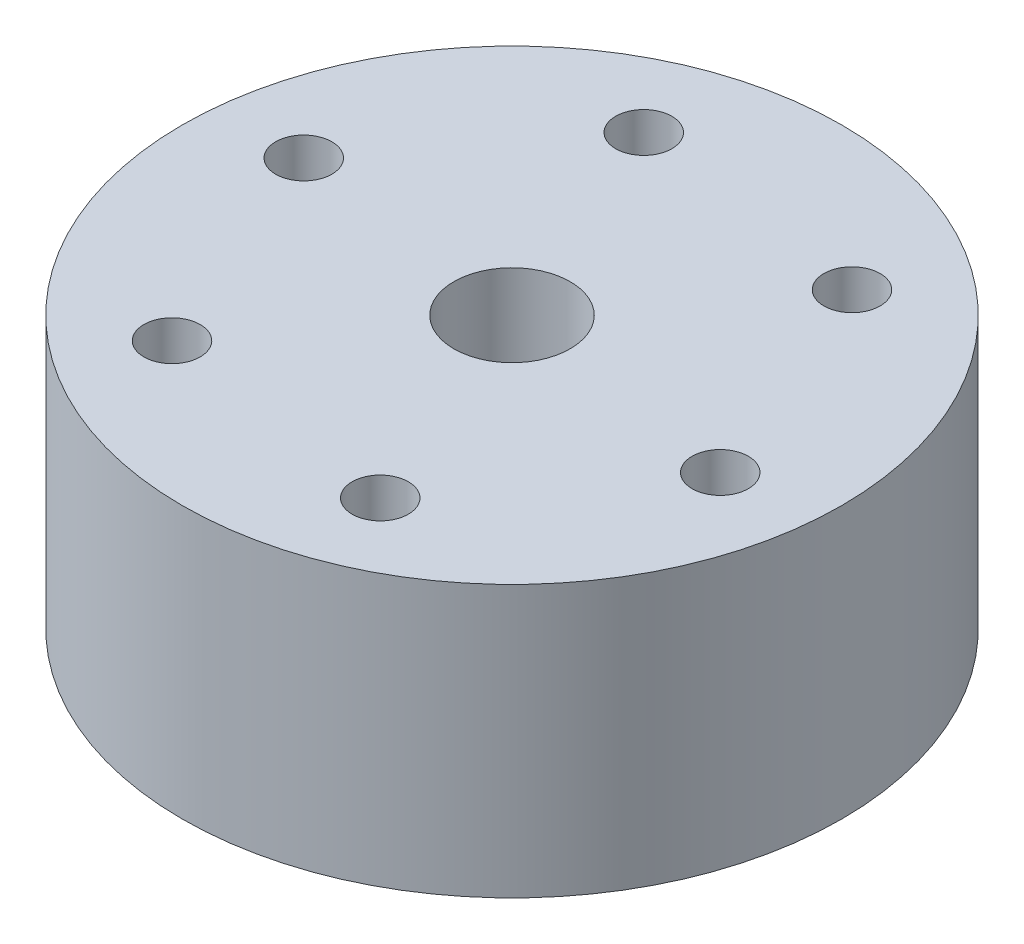
ISO-10303-21;
HEADER;
FILE_DESCRIPTION(('STEP AP214'),'2;1');
FILE_NAME('part.step','',(''),(''),'','','');
FILE_SCHEMA(('AUTOMOTIVE_DESIGN { 1 0 10303 214 1 1 1 1 }'));
ENDSEC;
DATA;
#1=APPLICATION_CONTEXT('core data for automotive mechanical design processes');
#2=APPLICATION_PROTOCOL_DEFINITION('international standard','automotive_design',2000,#1);
#3=PRODUCT_CONTEXT('',#1,'mechanical');
#4=PRODUCT('Part','Part','',(#3));
#5=PRODUCT_RELATED_PRODUCT_CATEGORY('part','',(#4));
#6=PRODUCT_DEFINITION_FORMATION('','',#4);
#7=PRODUCT_DEFINITION_CONTEXT('part definition',#1,'design');
#8=PRODUCT_DEFINITION('design','',#6,#7);
#9=PRODUCT_DEFINITION_SHAPE('','',#8);
#10=(LENGTH_UNIT() NAMED_UNIT(*) SI_UNIT(.MILLI.,.METRE.));
#11=(NAMED_UNIT(*) PLANE_ANGLE_UNIT() SI_UNIT($,.RADIAN.));
#12=(NAMED_UNIT(*) SI_UNIT($,.STERADIAN.) SOLID_ANGLE_UNIT());
#13=UNCERTAINTY_MEASURE_WITH_UNIT(LENGTH_MEASURE(1.E-05),#10,'distance_accuracy_value','');
#14=(GEOMETRIC_REPRESENTATION_CONTEXT(3) GLOBAL_UNCERTAINTY_ASSIGNED_CONTEXT((#13)) GLOBAL_UNIT_ASSIGNED_CONTEXT((#10,
#11,#12)) REPRESENTATION_CONTEXT('',''));
#15=CARTESIAN_POINT('',(0.,0.,0.));
#16=DIRECTION('',(0.,0.,1.));
#17=DIRECTION('',(1.,0.,0.));
#18=AXIS2_PLACEMENT_3D('',#15,#16,#17);
#19=CARTESIAN_POINT('',(0.,34.5,490.));
#20=DIRECTION('',(0.,-1.,0.));
#21=DIRECTION('',(0.,0.,-1.));
#22=AXIS2_PLACEMENT_3D('',#19,#20,#21);
#23=CYLINDRICAL_SURFACE('',#22,17.);
#24=CARTESIAN_POINT('',(0.,34.5,490.));
#25=DIRECTION('',(0.,1.,0.));
#26=DIRECTION('',(0.,0.,1.));
#27=AXIS2_PLACEMENT_3D('',#24,#25,#26);
#28=CIRCLE('',#27,17.);
#29=CARTESIAN_POINT('',(0.,34.5,507.));
#30=VERTEX_POINT('',#29);
#31=EDGE_CURVE('E10',#30,#30,#28,.T.);
#32=ORIENTED_EDGE('',*,*,#31,.F.);
#33=EDGE_LOOP('',(#32));
#34=FACE_BOUND('',#33,.T.);
#35=CARTESIAN_POINT('',(0.,20.5,490.));
#36=DIRECTION('',(0.,1.,0.));
#37=DIRECTION('',(0.,0.,1.));
#38=AXIS2_PLACEMENT_3D('',#35,#36,#37);
#39=CIRCLE('',#38,17.);
#40=CARTESIAN_POINT('',(0.,20.5,507.));
#41=VERTEX_POINT('',#40);
#42=EDGE_CURVE('E42',#41,#41,#39,.T.);
#43=ORIENTED_EDGE('',*,*,#42,.T.);
#44=EDGE_LOOP('',(#43));
#45=FACE_BOUND('',#44,.T.);
#46=ADVANCED_FACE('F41',(#34,#45),#23,.T.);
#47=CARTESIAN_POINT('',(0.,34.5,490.));
#48=DIRECTION('',(0.,1.,0.));
#49=DIRECTION('',(0.,0.,1.));
#50=AXIS2_PLACEMENT_3D('',#47,#48,#49);
#51=PLANE('',#50);
#52=CARTESIAN_POINT('',(0.,34.5,490.));
#53=DIRECTION('',(0.,1.,0.));
#54=DIRECTION('',(0.,0.,1.));
#55=AXIS2_PLACEMENT_3D('',#52,#53,#54);
#56=CIRCLE('',#55,3.);
#57=CARTESIAN_POINT('',(0.,34.5,493.));
#58=VERTEX_POINT('',#57);
#59=EDGE_CURVE('E91',#58,#58,#56,.T.);
#60=ORIENTED_EDGE('',*,*,#59,.F.);
#61=EDGE_LOOP('',(#60));
#62=FACE_BOUND('',#61,.T.);
#63=CARTESIAN_POINT('',(12.3901942531443,34.5,491.653204878214));
#64=DIRECTION('',(0.,1.,0.));
#65=DIRECTION('',(0.,0.,1.));
#66=AXIS2_PLACEMENT_3D('',#63,#64,#65);
#67=CIRCLE('',#66,1.45);
#68=CARTESIAN_POINT('',(12.3901942531443,34.5,493.103204878214));
#69=VERTEX_POINT('',#68);
#70=EDGE_CURVE('E54',#69,#69,#67,.T.);
#71=ORIENTED_EDGE('',*,*,#70,.F.);
#72=EDGE_LOOP('',(#71));
#73=FACE_BOUND('',#72,.T.);
#74=CARTESIAN_POINT('',(7.62681454876585,34.5,480.09637945806));
#75=DIRECTION('',(0.,1.,0.));
#76=DIRECTION('',(0.,0.,1.));
#77=AXIS2_PLACEMENT_3D('',#74,#75,#76);
#78=CIRCLE('',#77,1.45);
#79=CARTESIAN_POINT('',(7.62681454876585,34.5,481.54637945806));
#80=VERTEX_POINT('',#79);
#81=EDGE_CURVE('E89',#80,#80,#78,.T.);
#82=ORIENTED_EDGE('',*,*,#81,.F.);
#83=EDGE_LOOP('',(#82));
#84=FACE_BOUND('',#83,.T.);
#85=CARTESIAN_POINT('',(-4.76337970437842,34.5,478.443174579846));
#86=DIRECTION('',(0.,1.,0.));
#87=DIRECTION('',(0.,0.,1.));
#88=AXIS2_PLACEMENT_3D('',#85,#86,#87);
#89=CIRCLE('',#88,1.45);
#90=CARTESIAN_POINT('',(-4.76337970437842,34.5,479.893174579846));
#91=VERTEX_POINT('',#90);
#92=EDGE_CURVE('E60',#91,#91,#89,.T.);
#93=ORIENTED_EDGE('',*,*,#92,.F.);
#94=EDGE_LOOP('',(#93));
#95=FACE_BOUND('',#94,.T.);
#96=CARTESIAN_POINT('',(-12.3901942531443,34.5,488.346795121786));
#97=DIRECTION('',(0.,1.,0.));
#98=DIRECTION('',(0.,0.,1.));
#99=AXIS2_PLACEMENT_3D('',#96,#97,#98);
#100=CIRCLE('',#99,1.45);
#101=CARTESIAN_POINT('',(-12.3901942531443,34.5,489.796795121786));
#102=VERTEX_POINT('',#101);
#103=EDGE_CURVE('E67',#102,#102,#100,.T.);
#104=ORIENTED_EDGE('',*,*,#103,.F.);
#105=EDGE_LOOP('',(#104));
#106=FACE_BOUND('',#105,.T.);
#107=CARTESIAN_POINT('',(-7.62681454876585,34.5,499.90362054194));
#108=DIRECTION('',(0.,1.,0.));
#109=DIRECTION('',(0.,0.,1.));
#110=AXIS2_PLACEMENT_3D('',#107,#108,#109);
#111=CIRCLE('',#110,1.45);
#112=CARTESIAN_POINT('',(-7.62681454876585,34.5,501.35362054194));
#113=VERTEX_POINT('',#112);
#114=EDGE_CURVE('E74',#113,#113,#111,.T.);
#115=ORIENTED_EDGE('',*,*,#114,.F.);
#116=EDGE_LOOP('',(#115));
#117=FACE_BOUND('',#116,.T.);
#118=CARTESIAN_POINT('',(4.76337970437843,34.5,501.556825420154));
#119=DIRECTION('',(0.,1.,0.));
#120=DIRECTION('',(0.,0.,1.));
#121=AXIS2_PLACEMENT_3D('',#118,#119,#120);
#122=CIRCLE('',#121,1.45);
#123=CARTESIAN_POINT('',(4.76337970437843,34.5,503.006825420154));
#124=VERTEX_POINT('',#123);
#125=EDGE_CURVE('E85',#124,#124,#122,.T.);
#126=ORIENTED_EDGE('',*,*,#125,.F.);
#127=EDGE_LOOP('',(#126));
#128=FACE_BOUND('',#127,.T.);
#129=ORIENTED_EDGE('',*,*,#31,.T.);
#130=EDGE_LOOP('',(#129));
#131=FACE_BOUND('',#130,.T.);
#132=ADVANCED_FACE('F111',(#62,#73,#84,#95,#106,#117,#128,#131),#51,.T.);
#133=CARTESIAN_POINT('',(0.,20.5,490.));
#134=DIRECTION('',(0.,1.,0.));
#135=DIRECTION('',(0.,0.,1.));
#136=AXIS2_PLACEMENT_3D('',#133,#134,#135);
#137=PLANE('',#136);
#138=CARTESIAN_POINT('',(0.,20.5,490.));
#139=DIRECTION('',(0.,1.,0.));
#140=DIRECTION('',(0.,0.,1.));
#141=AXIS2_PLACEMENT_3D('',#138,#139,#140);
#142=CIRCLE('',#141,3.);
#143=CARTESIAN_POINT('',(0.,20.5,493.));
#144=VERTEX_POINT('',#143);
#145=EDGE_CURVE('E103',#144,#144,#142,.T.);
#146=ORIENTED_EDGE('',*,*,#145,.T.);
#147=EDGE_LOOP('',(#146));
#148=FACE_BOUND('',#147,.T.);
#149=CARTESIAN_POINT('',(12.3901942531443,20.5,491.653204878214));
#150=DIRECTION('',(0.,1.,0.));
#151=DIRECTION('',(0.,0.,1.));
#152=AXIS2_PLACEMENT_3D('',#149,#150,#151);
#153=CIRCLE('',#152,1.45);
#154=CARTESIAN_POINT('',(12.3901942531443,20.5,493.103204878214));
#155=VERTEX_POINT('',#154);
#156=EDGE_CURVE('E90',#155,#155,#153,.T.);
#157=ORIENTED_EDGE('',*,*,#156,.T.);
#158=EDGE_LOOP('',(#157));
#159=FACE_BOUND('',#158,.T.);
#160=CARTESIAN_POINT('',(7.62681454876585,20.5,480.09637945806));
#161=DIRECTION('',(0.,1.,0.));
#162=DIRECTION('',(0.,0.,1.));
#163=AXIS2_PLACEMENT_3D('',#160,#161,#162);
#164=CIRCLE('',#163,1.45);
#165=CARTESIAN_POINT('',(7.62681454876585,20.5,481.54637945806));
#166=VERTEX_POINT('',#165);
#167=EDGE_CURVE('E61',#166,#166,#164,.T.);
#168=ORIENTED_EDGE('',*,*,#167,.T.);
#169=EDGE_LOOP('',(#168));
#170=FACE_BOUND('',#169,.T.);
#171=CARTESIAN_POINT('',(-4.76337970437842,20.5,478.443174579846));
#172=DIRECTION('',(0.,1.,0.));
#173=DIRECTION('',(0.,0.,1.));
#174=AXIS2_PLACEMENT_3D('',#171,#172,#173);
#175=CIRCLE('',#174,1.45);
#176=CARTESIAN_POINT('',(-4.76337970437842,20.5,479.893174579846));
#177=VERTEX_POINT('',#176);
#178=EDGE_CURVE('E64',#177,#177,#175,.T.);
#179=ORIENTED_EDGE('',*,*,#178,.T.);
#180=EDGE_LOOP('',(#179));
#181=FACE_BOUND('',#180,.T.);
#182=CARTESIAN_POINT('',(-12.3901942531443,20.5,488.346795121786));
#183=DIRECTION('',(0.,1.,0.));
#184=DIRECTION('',(0.,0.,1.));
#185=AXIS2_PLACEMENT_3D('',#182,#183,#184);
#186=CIRCLE('',#185,1.45);
#187=CARTESIAN_POINT('',(-12.3901942531443,20.5,489.796795121786));
#188=VERTEX_POINT('',#187);
#189=EDGE_CURVE('E68',#188,#188,#186,.T.);
#190=ORIENTED_EDGE('',*,*,#189,.T.);
#191=EDGE_LOOP('',(#190));
#192=FACE_BOUND('',#191,.T.);
#193=CARTESIAN_POINT('',(-7.62681454876585,20.5,499.90362054194));
#194=DIRECTION('',(0.,1.,0.));
#195=DIRECTION('',(0.,0.,1.));
#196=AXIS2_PLACEMENT_3D('',#193,#194,#195);
#197=CIRCLE('',#196,1.45);
#198=CARTESIAN_POINT('',(-7.62681454876585,20.5,501.35362054194));
#199=VERTEX_POINT('',#198);
#200=EDGE_CURVE('E80',#199,#199,#197,.T.);
#201=ORIENTED_EDGE('',*,*,#200,.T.);
#202=EDGE_LOOP('',(#201));
#203=FACE_BOUND('',#202,.T.);
#204=CARTESIAN_POINT('',(4.76337970437843,20.5,501.556825420154));
#205=DIRECTION('',(0.,1.,0.));
#206=DIRECTION('',(0.,0.,1.));
#207=AXIS2_PLACEMENT_3D('',#204,#205,#206);
#208=CIRCLE('',#207,1.45);
#209=CARTESIAN_POINT('',(4.76337970437843,20.5,503.006825420154));
#210=VERTEX_POINT('',#209);
#211=EDGE_CURVE('E83',#210,#210,#208,.T.);
#212=ORIENTED_EDGE('',*,*,#211,.T.);
#213=EDGE_LOOP('',(#212));
#214=FACE_BOUND('',#213,.T.);
#215=ORIENTED_EDGE('',*,*,#42,.F.);
#216=EDGE_LOOP('',(#215));
#217=FACE_BOUND('',#216,.T.);
#218=ADVANCED_FACE('F116',(#148,#159,#170,#181,#192,#203,#214,#217),#137,.F.);
#219=CARTESIAN_POINT('',(4.76337970437843,34.5,501.556825420154));
#220=DIRECTION('',(0.,-1.,0.));
#221=DIRECTION('',(0.,0.,-1.));
#222=AXIS2_PLACEMENT_3D('',#219,#220,#221);
#223=CYLINDRICAL_SURFACE('',#222,1.45);
#224=ORIENTED_EDGE('',*,*,#125,.T.);
#225=EDGE_LOOP('',(#224));
#226=FACE_BOUND('',#225,.T.);
#227=ORIENTED_EDGE('',*,*,#211,.F.);
#228=EDGE_LOOP('',(#227));
#229=FACE_BOUND('',#228,.T.);
#230=ADVANCED_FACE('F134',(#226,#229),#223,.F.);
#231=CARTESIAN_POINT('',(-7.62681454876585,34.5,499.90362054194));
#232=DIRECTION('',(0.,-1.,0.));
#233=DIRECTION('',(0.,0.,-1.));
#234=AXIS2_PLACEMENT_3D('',#231,#232,#233);
#235=CYLINDRICAL_SURFACE('',#234,1.45);
#236=ORIENTED_EDGE('',*,*,#114,.T.);
#237=EDGE_LOOP('',(#236));
#238=FACE_BOUND('',#237,.T.);
#239=ORIENTED_EDGE('',*,*,#200,.F.);
#240=EDGE_LOOP('',(#239));
#241=FACE_BOUND('',#240,.T.);
#242=ADVANCED_FACE('F133',(#238,#241),#235,.F.);
#243=CARTESIAN_POINT('',(-12.3901942531443,34.5,488.346795121786));
#244=DIRECTION('',(0.,-1.,0.));
#245=DIRECTION('',(0.,0.,-1.));
#246=AXIS2_PLACEMENT_3D('',#243,#244,#245);
#247=CYLINDRICAL_SURFACE('',#246,1.45);
#248=ORIENTED_EDGE('',*,*,#103,.T.);
#249=EDGE_LOOP('',(#248));
#250=FACE_BOUND('',#249,.T.);
#251=ORIENTED_EDGE('',*,*,#189,.F.);
#252=EDGE_LOOP('',(#251));
#253=FACE_BOUND('',#252,.T.);
#254=ADVANCED_FACE('F165',(#250,#253),#247,.F.);
#255=CARTESIAN_POINT('',(-4.76337970437842,34.5,478.443174579846));
#256=DIRECTION('',(0.,-1.,0.));
#257=DIRECTION('',(0.,0.,-1.));
#258=AXIS2_PLACEMENT_3D('',#255,#256,#257);
#259=CYLINDRICAL_SURFACE('',#258,1.45);
#260=ORIENTED_EDGE('',*,*,#92,.T.);
#261=EDGE_LOOP('',(#260));
#262=FACE_BOUND('',#261,.T.);
#263=ORIENTED_EDGE('',*,*,#178,.F.);
#264=EDGE_LOOP('',(#263));
#265=FACE_BOUND('',#264,.T.);
#266=ADVANCED_FACE('F166',(#262,#265),#259,.F.);
#267=CARTESIAN_POINT('',(7.62681454876585,34.5,480.09637945806));
#268=DIRECTION('',(0.,-1.,0.));
#269=DIRECTION('',(0.,0.,-1.));
#270=AXIS2_PLACEMENT_3D('',#267,#268,#269);
#271=CYLINDRICAL_SURFACE('',#270,1.45);
#272=ORIENTED_EDGE('',*,*,#81,.T.);
#273=EDGE_LOOP('',(#272));
#274=FACE_BOUND('',#273,.T.);
#275=ORIENTED_EDGE('',*,*,#167,.F.);
#276=EDGE_LOOP('',(#275));
#277=FACE_BOUND('',#276,.T.);
#278=ADVANCED_FACE('F177',(#274,#277),#271,.F.);
#279=CARTESIAN_POINT('',(12.3901942531443,34.5,491.653204878214));
#280=DIRECTION('',(0.,-1.,0.));
#281=DIRECTION('',(0.,0.,-1.));
#282=AXIS2_PLACEMENT_3D('',#279,#280,#281);
#283=CYLINDRICAL_SURFACE('',#282,1.45);
#284=ORIENTED_EDGE('',*,*,#70,.T.);
#285=EDGE_LOOP('',(#284));
#286=FACE_BOUND('',#285,.T.);
#287=ORIENTED_EDGE('',*,*,#156,.F.);
#288=EDGE_LOOP('',(#287));
#289=FACE_BOUND('',#288,.T.);
#290=ADVANCED_FACE('F181',(#286,#289),#283,.F.);
#291=CARTESIAN_POINT('',(0.,34.5,490.));
#292=DIRECTION('',(0.,-1.,0.));
#293=DIRECTION('',(0.,0.,-1.));
#294=AXIS2_PLACEMENT_3D('',#291,#292,#293);
#295=CYLINDRICAL_SURFACE('',#294,3.);
#296=ORIENTED_EDGE('',*,*,#59,.T.);
#297=EDGE_LOOP('',(#296));
#298=FACE_BOUND('',#297,.T.);
#299=ORIENTED_EDGE('',*,*,#145,.F.);
#300=EDGE_LOOP('',(#299));
#301=FACE_BOUND('',#300,.T.);
#302=ADVANCED_FACE('F112',(#298,#301),#295,.F.);
#303=CLOSED_SHELL('',(#46,#132,#218,#230,#242,#254,#266,#278,#290,#302));
#304=MANIFOLD_SOLID_BREP('B2',#303);
#305=ADVANCED_BREP_SHAPE_REPRESENTATION('',(#18,#304),#14);
#306=SHAPE_DEFINITION_REPRESENTATION(#9,#305);
ENDSEC;
END-ISO-10303-21;
